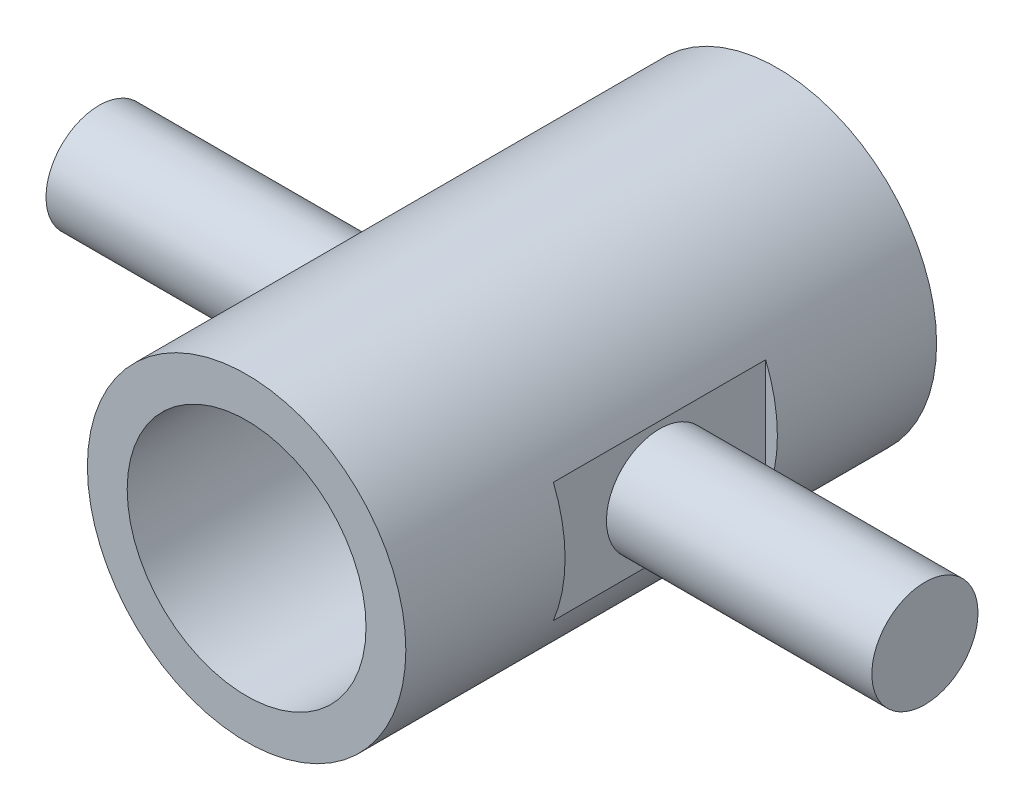
ISO-10303-21;
HEADER;
FILE_DESCRIPTION(('STEP AP214'),'2;1');
FILE_NAME('part.step','',(''),(''),'','','');
FILE_SCHEMA(('AUTOMOTIVE_DESIGN { 1 0 10303 214 1 1 1 1 }'));
ENDSEC;
DATA;
#1=APPLICATION_CONTEXT('core data for automotive mechanical design processes');
#2=APPLICATION_PROTOCOL_DEFINITION('international standard','automotive_design',2000,#1);
#3=PRODUCT_CONTEXT('',#1,'mechanical');
#4=PRODUCT('Part','Part','',(#3));
#5=PRODUCT_RELATED_PRODUCT_CATEGORY('part','',(#4));
#6=PRODUCT_DEFINITION_FORMATION('','',#4);
#7=PRODUCT_DEFINITION_CONTEXT('part definition',#1,'design');
#8=PRODUCT_DEFINITION('design','',#6,#7);
#9=PRODUCT_DEFINITION_SHAPE('','',#8);
#10=(LENGTH_UNIT() NAMED_UNIT(*) SI_UNIT(.MILLI.,.METRE.));
#11=(NAMED_UNIT(*) PLANE_ANGLE_UNIT() SI_UNIT($,.RADIAN.));
#12=(NAMED_UNIT(*) SI_UNIT($,.STERADIAN.) SOLID_ANGLE_UNIT());
#13=UNCERTAINTY_MEASURE_WITH_UNIT(LENGTH_MEASURE(1.E-05),#10,'distance_accuracy_value','');
#14=(GEOMETRIC_REPRESENTATION_CONTEXT(3) GLOBAL_UNCERTAINTY_ASSIGNED_CONTEXT((#13)) GLOBAL_UNIT_ASSIGNED_CONTEXT((#10,
#11,#12)) REPRESENTATION_CONTEXT('',''));
#15=CARTESIAN_POINT('',(0.,0.,0.));
#16=DIRECTION('',(0.,0.,1.));
#17=DIRECTION('',(1.,0.,0.));
#18=AXIS2_PLACEMENT_3D('',#15,#16,#17);
#19=CARTESIAN_POINT('',(2.77959398335244,1.12865286413093,3.));
#20=DIRECTION('',(-1.,0.,0.));
#21=DIRECTION('',(0.,-1.,0.));
#22=AXIS2_PLACEMENT_3D('',#19,#20,#21);
#23=PLANE('',#22);
#24=DIRECTION('',(0.,-1.,0.));
#25=VECTOR('',#24,1.);
#26=CARTESIAN_POINT('',(2.77959398335244,1.12865286413093,7.));
#27=LINE('',#26,#25);
#28=CARTESIAN_POINT('',(2.77959398335244,1.12865286413092,7.));
#29=VERTEX_POINT('',#28);
#30=CARTESIAN_POINT('',(2.77959398335244,-1.12865286413093,7.));
#31=VERTEX_POINT('',#30);
#32=EDGE_CURVE('E50',#29,#31,#27,.T.);
#33=ORIENTED_EDGE('',*,*,#32,.T.);
#34=DIRECTION('',(0.,0.,1.));
#35=VECTOR('',#34,1.);
#36=CARTESIAN_POINT('',(2.77959398335244,-1.12865286413093,3.));
#37=LINE('',#36,#35);
#38=CARTESIAN_POINT('',(2.77959398335244,-1.12865286413093,3.));
#39=VERTEX_POINT('',#38);
#40=EDGE_CURVE('E90',#39,#31,#37,.T.);
#41=ORIENTED_EDGE('',*,*,#40,.F.);
#42=DIRECTION('',(0.,-1.,0.));
#43=VECTOR('',#42,1.);
#44=CARTESIAN_POINT('',(2.77959398335244,1.12865286413093,3.));
#45=LINE('',#44,#43);
#46=CARTESIAN_POINT('',(2.77959398335244,1.12865286413093,3.));
#47=VERTEX_POINT('',#46);
#48=EDGE_CURVE('E80',#47,#39,#45,.T.);
#49=ORIENTED_EDGE('',*,*,#48,.F.);
#50=DIRECTION('',(0.,0.,1.));
#51=VECTOR('',#50,1.);
#52=CARTESIAN_POINT('',(2.77959398335244,1.12865286413093,3.));
#53=LINE('',#52,#51);
#54=EDGE_CURVE('E88',#47,#29,#53,.T.);
#55=ORIENTED_EDGE('',*,*,#54,.T.);
#56=EDGE_LOOP('',(#33,#41,#49,#55));
#57=FACE_BOUND('',#56,.T.);
#58=CARTESIAN_POINT('',(2.77959398335244,0.,5.));
#59=DIRECTION('',(-1.,0.,0.));
#60=DIRECTION('',(0.,-1.,0.));
#61=AXIS2_PLACEMENT_3D('',#58,#59,#60);
#62=CIRCLE('',#61,1.);
#63=CARTESIAN_POINT('',(2.77959398335244,-1.,5.));
#64=VERTEX_POINT('',#63);
#65=EDGE_CURVE('E11',#64,#64,#62,.F.);
#66=ORIENTED_EDGE('',*,*,#65,.F.);
#67=EDGE_LOOP('',(#66));
#68=FACE_BOUND('',#67,.T.);
#69=ADVANCED_FACE('F36',(#57,#68),#23,.F.);
#70=CARTESIAN_POINT('',(-2.77959398335244,1.12865286413093,3.));
#71=DIRECTION('',(1.,0.,0.));
#72=DIRECTION('',(0.,1.,0.));
#73=AXIS2_PLACEMENT_3D('',#70,#71,#72);
#74=PLANE('',#73);
#75=DIRECTION('',(0.,1.,0.));
#76=VECTOR('',#75,1.);
#77=CARTESIAN_POINT('',(-2.77959398335244,1.12865286413093,7.));
#78=LINE('',#77,#76);
#79=CARTESIAN_POINT('',(-2.77959398335244,-1.12865286413093,7.));
#80=VERTEX_POINT('',#79);
#81=CARTESIAN_POINT('',(-2.77959398335244,1.12865286413093,7.));
#82=VERTEX_POINT('',#81);
#83=EDGE_CURVE('E57',#80,#82,#78,.T.);
#84=ORIENTED_EDGE('',*,*,#83,.T.);
#85=DIRECTION('',(0.,0.,1.));
#86=VECTOR('',#85,1.);
#87=CARTESIAN_POINT('',(-2.77959398335244,1.12865286413093,3.));
#88=LINE('',#87,#86);
#89=CARTESIAN_POINT('',(-2.77959398335244,1.12865286413093,3.));
#90=VERTEX_POINT('',#89);
#91=EDGE_CURVE('E100',#90,#82,#88,.T.);
#92=ORIENTED_EDGE('',*,*,#91,.F.);
#93=DIRECTION('',(0.,1.,0.));
#94=VECTOR('',#93,1.);
#95=CARTESIAN_POINT('',(-2.77959398335244,1.12865286413093,3.));
#96=LINE('',#95,#94);
#97=CARTESIAN_POINT('',(-2.77959398335244,-1.12865286413093,3.));
#98=VERTEX_POINT('',#97);
#99=EDGE_CURVE('E97',#98,#90,#96,.T.);
#100=ORIENTED_EDGE('',*,*,#99,.F.);
#101=DIRECTION('',(0.,0.,1.));
#102=VECTOR('',#101,1.);
#103=CARTESIAN_POINT('',(-2.77959398335244,-1.12865286413093,3.));
#104=LINE('',#103,#102);
#105=EDGE_CURVE('E102',#98,#80,#104,.T.);
#106=ORIENTED_EDGE('',*,*,#105,.T.);
#107=EDGE_LOOP('',(#84,#92,#100,#106));
#108=FACE_BOUND('',#107,.T.);
#109=CARTESIAN_POINT('',(-2.77959398335244,0.,5.));
#110=DIRECTION('',(1.,0.,0.));
#111=DIRECTION('',(0.,1.,0.));
#112=AXIS2_PLACEMENT_3D('',#109,#110,#111);
#113=CIRCLE('',#112,1.);
#114=CARTESIAN_POINT('',(-2.77959398335244,0.999999999999999,5.));
#115=VERTEX_POINT('',#114);
#116=EDGE_CURVE('E44',#115,#115,#113,.F.);
#117=ORIENTED_EDGE('',*,*,#116,.F.);
#118=EDGE_LOOP('',(#117));
#119=FACE_BOUND('',#118,.T.);
#120=ADVANCED_FACE('F128',(#108,#119),#74,.F.);
#121=CARTESIAN_POINT('',(0.,0.,10.));
#122=DIRECTION('',(0.,0.,-1.));
#123=DIRECTION('',(-1.,0.,0.));
#124=AXIS2_PLACEMENT_3D('',#121,#122,#123);
#125=CYLINDRICAL_SURFACE('',#124,3.);
#126=ORIENTED_EDGE('',*,*,#54,.F.);
#127=CARTESIAN_POINT('',(0.,0.,3.));
#128=DIRECTION('',(0.,0.,-1.));
#129=DIRECTION('',(-1.,0.,0.));
#130=AXIS2_PLACEMENT_3D('',#127,#128,#129);
#131=CIRCLE('',#130,3.);
#132=EDGE_CURVE('E77',#47,#39,#131,.T.);
#133=ORIENTED_EDGE('',*,*,#132,.T.);
#134=ORIENTED_EDGE('',*,*,#40,.T.);
#135=CARTESIAN_POINT('',(0.,0.,7.));
#136=DIRECTION('',(0.,0.,-1.));
#137=DIRECTION('',(-1.,0.,0.));
#138=AXIS2_PLACEMENT_3D('',#135,#136,#137);
#139=CIRCLE('',#138,3.);
#140=EDGE_CURVE('E84',#29,#31,#139,.T.);
#141=ORIENTED_EDGE('',*,*,#140,.F.);
#142=EDGE_LOOP('',(#126,#133,#134,#141));
#143=FACE_BOUND('',#142,.T.);
#144=CARTESIAN_POINT('',(0.,0.,0.));
#145=DIRECTION('',(0.,0.,1.));
#146=DIRECTION('',(1.,0.,0.));
#147=AXIS2_PLACEMENT_3D('',#144,#145,#146);
#148=CIRCLE('',#147,3.);
#149=CARTESIAN_POINT('',(3.,0.,0.));
#150=VERTEX_POINT('',#149);
#151=EDGE_CURVE('E110',#150,#150,#148,.T.);
#152=ORIENTED_EDGE('',*,*,#151,.T.);
#153=EDGE_LOOP('',(#152));
#154=FACE_BOUND('',#153,.T.);
#155=CARTESIAN_POINT('',(0.,0.,10.));
#156=DIRECTION('',(0.,0.,1.));
#157=DIRECTION('',(1.,0.,0.));
#158=AXIS2_PLACEMENT_3D('',#155,#156,#157);
#159=CIRCLE('',#158,3.);
#160=CARTESIAN_POINT('',(3.,0.,10.));
#161=VERTEX_POINT('',#160);
#162=EDGE_CURVE('E113',#161,#161,#159,.T.);
#163=ORIENTED_EDGE('',*,*,#162,.F.);
#164=EDGE_LOOP('',(#163));
#165=FACE_BOUND('',#164,.T.);
#166=CARTESIAN_POINT('',(0.,0.,3.));
#167=DIRECTION('',(0.,0.,1.));
#168=DIRECTION('',(1.,0.,0.));
#169=AXIS2_PLACEMENT_3D('',#166,#167,#168);
#170=CIRCLE('',#169,3.);
#171=EDGE_CURVE('E121',#90,#98,#170,.T.);
#172=ORIENTED_EDGE('',*,*,#171,.F.);
#173=ORIENTED_EDGE('',*,*,#91,.T.);
#174=CARTESIAN_POINT('',(0.,0.,7.));
#175=DIRECTION('',(0.,0.,1.));
#176=DIRECTION('',(1.,0.,0.));
#177=AXIS2_PLACEMENT_3D('',#174,#175,#176);
#178=CIRCLE('',#177,3.);
#179=EDGE_CURVE('E116',#82,#80,#178,.T.);
#180=ORIENTED_EDGE('',*,*,#179,.T.);
#181=ORIENTED_EDGE('',*,*,#105,.F.);
#182=EDGE_LOOP('',(#172,#173,#180,#181));
#183=FACE_BOUND('',#182,.T.);
#184=ADVANCED_FACE('F38',(#143,#154,#165,#183),#125,.T.);
#185=CARTESIAN_POINT('',(0.,0.,10.));
#186=DIRECTION('',(0.,0.,1.));
#187=DIRECTION('',(1.,0.,0.));
#188=AXIS2_PLACEMENT_3D('',#185,#186,#187);
#189=PLANE('',#188);
#190=ORIENTED_EDGE('',*,*,#162,.T.);
#191=EDGE_LOOP('',(#190));
#192=FACE_BOUND('',#191,.T.);
#193=CARTESIAN_POINT('',(0.,0.,10.));
#194=DIRECTION('',(0.,0.,1.));
#195=DIRECTION('',(1.,0.,0.));
#196=AXIS2_PLACEMENT_3D('',#193,#194,#195);
#197=CIRCLE('',#196,2.25);
#198=CARTESIAN_POINT('',(2.25,0.,10.));
#199=VERTEX_POINT('',#198);
#200=EDGE_CURVE('E107',#199,#199,#197,.T.);
#201=ORIENTED_EDGE('',*,*,#200,.F.);
#202=EDGE_LOOP('',(#201));
#203=FACE_BOUND('',#202,.T.);
#204=ADVANCED_FACE('F136',(#192,#203),#189,.T.);
#205=CARTESIAN_POINT('',(0.,0.,0.));
#206=DIRECTION('',(0.,0.,1.));
#207=DIRECTION('',(1.,0.,0.));
#208=AXIS2_PLACEMENT_3D('',#205,#206,#207);
#209=PLANE('',#208);
#210=ORIENTED_EDGE('',*,*,#151,.F.);
#211=EDGE_LOOP('',(#210));
#212=FACE_BOUND('',#211,.T.);
#213=CARTESIAN_POINT('',(0.,0.,0.));
#214=DIRECTION('',(0.,0.,1.));
#215=DIRECTION('',(1.,0.,0.));
#216=AXIS2_PLACEMENT_3D('',#213,#214,#215);
#217=CIRCLE('',#216,2.25);
#218=CARTESIAN_POINT('',(2.25,0.,0.));
#219=VERTEX_POINT('',#218);
#220=EDGE_CURVE('E104',#219,#219,#217,.T.);
#221=ORIENTED_EDGE('',*,*,#220,.T.);
#222=EDGE_LOOP('',(#221));
#223=FACE_BOUND('',#222,.T.);
#224=ADVANCED_FACE('F146',(#212,#223),#209,.F.);
#225=CARTESIAN_POINT('',(0.,0.,10.));
#226=DIRECTION('',(0.,0.,-1.));
#227=DIRECTION('',(-1.,0.,0.));
#228=AXIS2_PLACEMENT_3D('',#225,#226,#227);
#229=CYLINDRICAL_SURFACE('',#228,2.25);
#230=ORIENTED_EDGE('',*,*,#200,.T.);
#231=EDGE_LOOP('',(#230));
#232=FACE_BOUND('',#231,.T.);
#233=ORIENTED_EDGE('',*,*,#220,.F.);
#234=EDGE_LOOP('',(#233));
#235=FACE_BOUND('',#234,.T.);
#236=ADVANCED_FACE('F142',(#232,#235),#229,.F.);
#237=CARTESIAN_POINT('',(0.,0.,3.));
#238=DIRECTION('',(0.,0.,1.));
#239=DIRECTION('',(1.,0.,0.));
#240=AXIS2_PLACEMENT_3D('',#237,#238,#239);
#241=PLANE('',#240);
#242=ORIENTED_EDGE('',*,*,#171,.T.);
#243=ORIENTED_EDGE('',*,*,#99,.T.);
#244=EDGE_LOOP('',(#242,#243));
#245=FACE_BOUND('',#244,.T.);
#246=ADVANCED_FACE('F145',(#245),#241,.T.);
#247=CARTESIAN_POINT('',(0.,0.,7.));
#248=DIRECTION('',(0.,0.,1.));
#249=DIRECTION('',(1.,0.,0.));
#250=AXIS2_PLACEMENT_3D('',#247,#248,#249);
#251=PLANE('',#250);
#252=ORIENTED_EDGE('',*,*,#83,.F.);
#253=ORIENTED_EDGE('',*,*,#179,.F.);
#254=EDGE_LOOP('',(#252,#253));
#255=FACE_BOUND('',#254,.T.);
#256=ADVANCED_FACE('F140',(#255),#251,.F.);
#257=CARTESIAN_POINT('',(0.,0.,3.));
#258=DIRECTION('',(0.,0.,-1.));
#259=DIRECTION('',(-1.,0.,0.));
#260=AXIS2_PLACEMENT_3D('',#257,#258,#259);
#261=PLANE('',#260);
#262=ORIENTED_EDGE('',*,*,#48,.T.);
#263=ORIENTED_EDGE('',*,*,#132,.F.);
#264=EDGE_LOOP('',(#262,#263));
#265=FACE_BOUND('',#264,.T.);
#266=ADVANCED_FACE('F79',(#265),#261,.F.);
#267=CARTESIAN_POINT('',(0.,0.,7.));
#268=DIRECTION('',(0.,0.,-1.));
#269=DIRECTION('',(-1.,0.,0.));
#270=AXIS2_PLACEMENT_3D('',#267,#268,#269);
#271=PLANE('',#270);
#272=ORIENTED_EDGE('',*,*,#140,.T.);
#273=ORIENTED_EDGE('',*,*,#32,.F.);
#274=EDGE_LOOP('',(#272,#273));
#275=FACE_BOUND('',#274,.T.);
#276=ADVANCED_FACE('F170',(#275),#271,.T.);
#277=CARTESIAN_POINT('',(-7.77959398335244,0.,5.));
#278=DIRECTION('',(1.,0.,0.));
#279=DIRECTION('',(0.,0.,-1.));
#280=AXIS2_PLACEMENT_3D('',#277,#278,#279);
#281=CYLINDRICAL_SURFACE('',#280,1.);
#282=CARTESIAN_POINT('',(-7.77959398335244,0.,5.));
#283=DIRECTION('',(-1.,0.,0.));
#284=DIRECTION('',(0.,0.,1.));
#285=AXIS2_PLACEMENT_3D('',#282,#283,#284);
#286=CIRCLE('',#285,1.);
#287=CARTESIAN_POINT('',(-7.77959398335244,0.,6.));
#288=VERTEX_POINT('',#287);
#289=EDGE_CURVE('E196',#288,#288,#286,.T.);
#290=ORIENTED_EDGE('',*,*,#289,.F.);
#291=EDGE_LOOP('',(#290));
#292=FACE_BOUND('',#291,.T.);
#293=ORIENTED_EDGE('',*,*,#116,.T.);
#294=EDGE_LOOP('',(#293));
#295=FACE_BOUND('',#294,.T.);
#296=ADVANCED_FACE('F126',(#292,#295),#281,.T.);
#297=CARTESIAN_POINT('',(-7.77959398335244,0.,5.));
#298=DIRECTION('',(-1.,0.,0.));
#299=DIRECTION('',(0.,0.,1.));
#300=AXIS2_PLACEMENT_3D('',#297,#298,#299);
#301=PLANE('',#300);
#302=ORIENTED_EDGE('',*,*,#289,.T.);
#303=EDGE_LOOP('',(#302));
#304=FACE_BOUND('',#303,.T.);
#305=ADVANCED_FACE('F179',(#304),#301,.T.);
#306=CARTESIAN_POINT('',(7.77959398335244,0.,5.));
#307=DIRECTION('',(-1.,0.,0.));
#308=DIRECTION('',(0.,0.,1.));
#309=AXIS2_PLACEMENT_3D('',#306,#307,#308);
#310=CYLINDRICAL_SURFACE('',#309,1.);
#311=CARTESIAN_POINT('',(7.77959398335244,0.,5.));
#312=DIRECTION('',(1.,0.,0.));
#313=DIRECTION('',(0.,0.,-1.));
#314=AXIS2_PLACEMENT_3D('',#311,#312,#313);
#315=CIRCLE('',#314,1.);
#316=CARTESIAN_POINT('',(7.77959398335244,0.,4.));
#317=VERTEX_POINT('',#316);
#318=EDGE_CURVE('E195',#317,#317,#315,.T.);
#319=ORIENTED_EDGE('',*,*,#318,.F.);
#320=EDGE_LOOP('',(#319));
#321=FACE_BOUND('',#320,.T.);
#322=ORIENTED_EDGE('',*,*,#65,.T.);
#323=EDGE_LOOP('',(#322));
#324=FACE_BOUND('',#323,.T.);
#325=ADVANCED_FACE('F183',(#321,#324),#310,.T.);
#326=CARTESIAN_POINT('',(7.77959398335244,0.,5.));
#327=DIRECTION('',(1.,0.,0.));
#328=DIRECTION('',(0.,0.,-1.));
#329=AXIS2_PLACEMENT_3D('',#326,#327,#328);
#330=PLANE('',#329);
#331=ORIENTED_EDGE('',*,*,#318,.T.);
#332=EDGE_LOOP('',(#331));
#333=FACE_BOUND('',#332,.T.);
#334=ADVANCED_FACE('F187',(#333),#330,.T.);
#335=CLOSED_SHELL('',(#69,#120,#184,#204,#224,#236,#246,#256,#266,#276,#296,#305,#325,#334));
#336=MANIFOLD_SOLID_BREP('B2',#335);
#337=ADVANCED_BREP_SHAPE_REPRESENTATION('',(#18,#336),#14);
#338=SHAPE_DEFINITION_REPRESENTATION(#9,#337);
ENDSEC;
END-ISO-10303-21;
